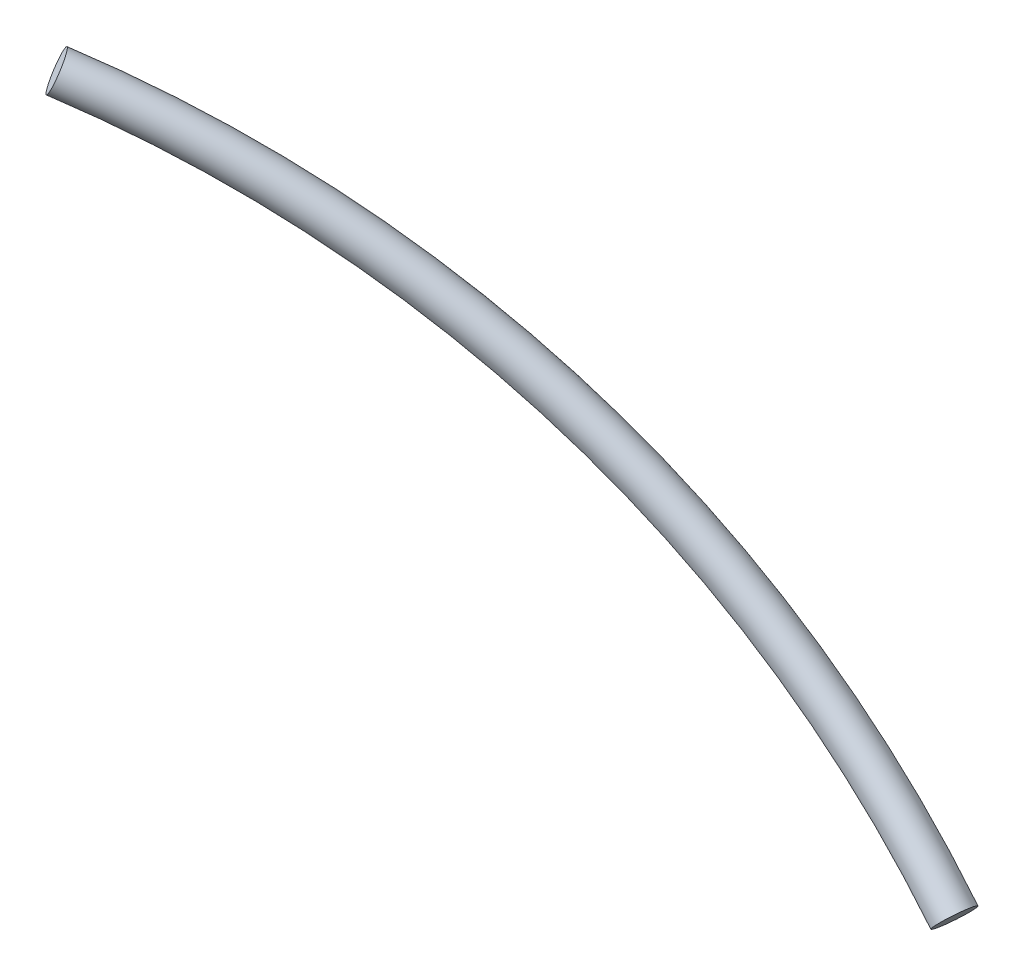
ISO-10303-21;
HEADER;
FILE_DESCRIPTION(('STEP AP214'),'2;1');
FILE_NAME('part.step','',(''),(''),'','','');
FILE_SCHEMA(('AUTOMOTIVE_DESIGN { 1 0 10303 214 1 1 1 1 }'));
ENDSEC;
DATA;
#1=APPLICATION_CONTEXT('core data for automotive mechanical design processes');
#2=APPLICATION_PROTOCOL_DEFINITION('international standard','automotive_design',2000,#1);
#3=PRODUCT_CONTEXT('',#1,'mechanical');
#4=PRODUCT('Part','Part','',(#3));
#5=PRODUCT_RELATED_PRODUCT_CATEGORY('part','',(#4));
#6=PRODUCT_DEFINITION_FORMATION('','',#4);
#7=PRODUCT_DEFINITION_CONTEXT('part definition',#1,'design');
#8=PRODUCT_DEFINITION('design','',#6,#7);
#9=PRODUCT_DEFINITION_SHAPE('','',#8);
#10=(LENGTH_UNIT() NAMED_UNIT(*) SI_UNIT(.MILLI.,.METRE.));
#11=(NAMED_UNIT(*) PLANE_ANGLE_UNIT() SI_UNIT($,.RADIAN.));
#12=(NAMED_UNIT(*) SI_UNIT($,.STERADIAN.) SOLID_ANGLE_UNIT());
#13=UNCERTAINTY_MEASURE_WITH_UNIT(LENGTH_MEASURE(1.E-05),#10,'distance_accuracy_value','');
#14=(GEOMETRIC_REPRESENTATION_CONTEXT(3) GLOBAL_UNCERTAINTY_ASSIGNED_CONTEXT((#13)) GLOBAL_UNIT_ASSIGNED_CONTEXT((#10,
#11,#12)) REPRESENTATION_CONTEXT('',''));
#15=CARTESIAN_POINT('',(0.,0.,0.));
#16=DIRECTION('',(0.,0.,1.));
#17=DIRECTION('',(1.,0.,0.));
#18=AXIS2_PLACEMENT_3D('',#15,#16,#17);
#19=CARTESIAN_POINT('',(4865.55061489688,1390.58691480155,-13534.9230365));
#20=DIRECTION('',(0.619116055076752,0.715004599948805,0.324751801224028));
#21=DIRECTION('',(-0.755979222276281,0.654595612180948,0.));
#22=AXIS2_PLACEMENT_3D('',#19,#20,#21);
#23=TOROIDAL_SURFACE('',#22,3312.93619363364,50.8000000000046);
#24=CARTESIAN_POINT('',(5835.00269042696,1966.06146890913,-16650.1337731779));
#25=DIRECTION('',(0.72874219839538,-0.677196347413947,0.101685374204344));
#26=DIRECTION('',(-0.164658978096867,-0.317420315198898,-0.933879951830602));
#27=AXIS2_PLACEMENT_3D('',#24,#25,#26);
#28=CIRCLE('',#27,50.8000000000046);
#29=CARTESIAN_POINT('',(5849.86810363098,1974.8856978227,-16697.9018846578));
#30=VERTEX_POINT('',#29);
#31=EDGE_CURVE('E10',#30,#30,#28,.T.);
#32=CARTESIAN_POINT('',(3963.23843506777,3323.26733444824,-16069.9033813418));
#33=DIRECTION('',(0.736556308924198,-0.385283461504498,-0.555914973782028));
#34=DIRECTION('',(-0.602423075023389,0.,-0.798176946973141));
#35=AXIS2_PLACEMENT_3D('',#32,#33,#34);
#36=CIRCLE('',#35,50.8000000000046);
#37=CARTESIAN_POINT('',(3949.40253360266,3352.90272721757,-16108.7743387014));
#38=VERTEX_POINT('',#37);
#39=EDGE_CURVE('E39',#38,#38,#36,.T.);
#40=CARTESIAN_POINT('',(4865.55061489688,1390.58691480155,-13534.9230365));
#41=DIRECTION('',(0.619116055076752,0.715004599948805,0.324751801224028));
#42=DIRECTION('',(-0.755979222276281,0.654595612180948,0.));
#43=AXIS2_PLACEMENT_3D('',#40,#41,#42);
#44=CIRCLE('',#43,3363.73619363365);
#45=EDGE_CURVE('',#30,#38,#44,.T.);
#46=ORIENTED_EDGE('',*,*,#31,.F.);
#47=ORIENTED_EDGE('',*,*,#39,.T.);
#48=ORIENTED_EDGE('',*,*,#45,.T.);
#49=ORIENTED_EDGE('',*,*,#45,.F.);
#50=EDGE_LOOP('',(#46,#48,#47,#49));
#51=FACE_BOUND('',#50,.T.);
#52=ADVANCED_FACE('F33',(#51),#23,.T.);
#53=CARTESIAN_POINT('',(5835.00269042696,1966.06146890913,-16650.1337731779));
#54=DIRECTION('',(0.72874219839538,-0.677196347413947,0.101685374204344));
#55=DIRECTION('',(-0.164658978096867,-0.317420315198898,-0.933879951830602));
#56=AXIS2_PLACEMENT_3D('',#53,#54,#55);
#57=PLANE('',#56);
#58=ORIENTED_EDGE('',*,*,#31,.T.);
#59=EDGE_LOOP('',(#58));
#60=FACE_BOUND('',#59,.T.);
#61=ADVANCED_FACE('F48',(#60),#57,.T.);
#62=CARTESIAN_POINT('',(3963.23843506777,3323.26733444824,-16069.9033813418));
#63=DIRECTION('',(0.736556308924198,-0.385283461504498,-0.555914973782028));
#64=DIRECTION('',(-0.602423075023389,0.,-0.798176946973141));
#65=AXIS2_PLACEMENT_3D('',#62,#63,#64);
#66=PLANE('',#65);
#67=ORIENTED_EDGE('',*,*,#39,.F.);
#68=EDGE_LOOP('',(#67));
#69=FACE_BOUND('',#68,.T.);
#70=ADVANCED_FACE('F46',(#69),#66,.F.);
#71=CLOSED_SHELL('',(#52,#61,#70));
#72=MANIFOLD_SOLID_BREP('B2',#71);
#73=ADVANCED_BREP_SHAPE_REPRESENTATION('',(#18,#72),#14);
#74=SHAPE_DEFINITION_REPRESENTATION(#9,#73);
ENDSEC;
END-ISO-10303-21;
